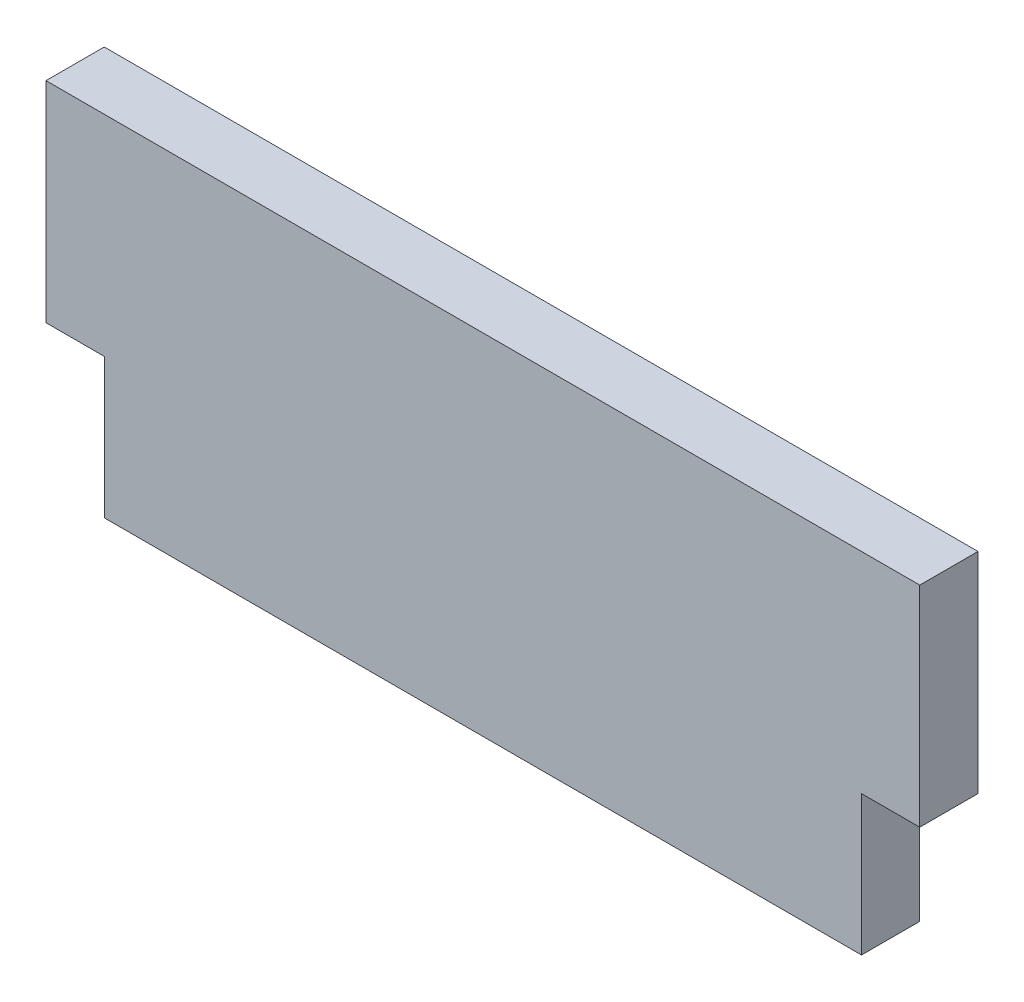
ISO-10303-21;
HEADER;
FILE_DESCRIPTION(('STEP AP214'),'2;1');
FILE_NAME('part.step','',(''),(''),'','','');
FILE_SCHEMA(('AUTOMOTIVE_DESIGN { 1 0 10303 214 1 1 1 1 }'));
ENDSEC;
DATA;
#1=APPLICATION_CONTEXT('core data for automotive mechanical design processes');
#2=APPLICATION_PROTOCOL_DEFINITION('international standard','automotive_design',2000,#1);
#3=PRODUCT_CONTEXT('',#1,'mechanical');
#4=PRODUCT('Part','Part','',(#3));
#5=PRODUCT_RELATED_PRODUCT_CATEGORY('part','',(#4));
#6=PRODUCT_DEFINITION_FORMATION('','',#4);
#7=PRODUCT_DEFINITION_CONTEXT('part definition',#1,'design');
#8=PRODUCT_DEFINITION('design','',#6,#7);
#9=PRODUCT_DEFINITION_SHAPE('','',#8);
#10=(LENGTH_UNIT() NAMED_UNIT(*) SI_UNIT(.MILLI.,.METRE.));
#11=(NAMED_UNIT(*) PLANE_ANGLE_UNIT() SI_UNIT($,.RADIAN.));
#12=(NAMED_UNIT(*) SI_UNIT($,.STERADIAN.) SOLID_ANGLE_UNIT());
#13=UNCERTAINTY_MEASURE_WITH_UNIT(LENGTH_MEASURE(1.E-05),#10,'distance_accuracy_value','');
#14=(GEOMETRIC_REPRESENTATION_CONTEXT(3) GLOBAL_UNCERTAINTY_ASSIGNED_CONTEXT((#13)) GLOBAL_UNIT_ASSIGNED_CONTEXT((#10,
#11,#12)) REPRESENTATION_CONTEXT('',''));
#15=CARTESIAN_POINT('',(0.,0.,0.));
#16=DIRECTION('',(0.,0.,1.));
#17=DIRECTION('',(1.,0.,0.));
#18=AXIS2_PLACEMENT_3D('',#15,#16,#17);
#19=CARTESIAN_POINT('',(0.,0.,5.));
#20=DIRECTION('',(1.,0.,0.));
#21=DIRECTION('',(0.,0.,-1.));
#22=AXIS2_PLACEMENT_3D('',#19,#20,#21);
#23=PLANE('',#22);
#24=DIRECTION('',(0.,-1.,0.));
#25=VECTOR('',#24,1.);
#26=CARTESIAN_POINT('',(0.,0.,0.));
#27=LINE('',#26,#25);
#28=CARTESIAN_POINT('',(0.,30.,0.));
#29=VERTEX_POINT('',#28);
#30=CARTESIAN_POINT('',(0.,12.,0.));
#31=VERTEX_POINT('',#30);
#32=EDGE_CURVE('E128',#29,#31,#27,.T.);
#33=ORIENTED_EDGE('',*,*,#32,.T.);
#34=DIRECTION('',(0.,0.,1.));
#35=VECTOR('',#34,1.);
#36=CARTESIAN_POINT('',(0.,12.,0.));
#37=LINE('',#36,#35);
#38=CARTESIAN_POINT('',(0.,12.,5.));
#39=VERTEX_POINT('',#38);
#40=EDGE_CURVE('E135',#31,#39,#37,.T.);
#41=ORIENTED_EDGE('',*,*,#40,.T.);
#42=DIRECTION('',(0.,-1.,0.));
#43=VECTOR('',#42,1.);
#44=CARTESIAN_POINT('',(0.,0.,5.));
#45=LINE('',#44,#43);
#46=CARTESIAN_POINT('',(0.,30.,5.));
#47=VERTEX_POINT('',#46);
#48=EDGE_CURVE('E140',#47,#39,#45,.T.);
#49=ORIENTED_EDGE('',*,*,#48,.F.);
#50=DIRECTION('',(0.,0.,-1.));
#51=VECTOR('',#50,1.);
#52=CARTESIAN_POINT('',(0.,30.,5.));
#53=LINE('',#52,#51);
#54=EDGE_CURVE('E46',#47,#29,#53,.T.);
#55=ORIENTED_EDGE('',*,*,#54,.T.);
#56=EDGE_LOOP('',(#33,#41,#49,#55));
#57=FACE_BOUND('',#56,.T.);
#58=ADVANCED_FACE('F38',(#57),#23,.F.);
#59=CARTESIAN_POINT('',(0.,0.,5.));
#60=DIRECTION('',(0.,1.,0.));
#61=DIRECTION('',(0.,0.,1.));
#62=AXIS2_PLACEMENT_3D('',#59,#60,#61);
#63=PLANE('',#62);
#64=DIRECTION('',(1.,0.,0.));
#65=VECTOR('',#64,1.);
#66=CARTESIAN_POINT('',(0.,0.,5.));
#67=LINE('',#66,#65);
#68=CARTESIAN_POINT('',(5.,0.,5.));
#69=VERTEX_POINT('',#68);
#70=CARTESIAN_POINT('',(70.,0.,5.));
#71=VERTEX_POINT('',#70);
#72=EDGE_CURVE('E121',#69,#71,#67,.T.);
#73=ORIENTED_EDGE('',*,*,#72,.F.);
#74=DIRECTION('',(0.,0.,1.));
#75=VECTOR('',#74,1.);
#76=CARTESIAN_POINT('',(5.,0.,0.));
#77=LINE('',#76,#75);
#78=CARTESIAN_POINT('',(5.,0.,0.));
#79=VERTEX_POINT('',#78);
#80=EDGE_CURVE('E106',#79,#69,#77,.T.);
#81=ORIENTED_EDGE('',*,*,#80,.F.);
#82=DIRECTION('',(1.,0.,0.));
#83=VECTOR('',#82,1.);
#84=CARTESIAN_POINT('',(0.,0.,0.));
#85=LINE('',#84,#83);
#86=CARTESIAN_POINT('',(70.,0.,0.));
#87=VERTEX_POINT('',#86);
#88=EDGE_CURVE('E119',#79,#87,#85,.T.);
#89=ORIENTED_EDGE('',*,*,#88,.T.);
#90=DIRECTION('',(0.,0.,1.));
#91=VECTOR('',#90,1.);
#92=CARTESIAN_POINT('',(70.,0.,0.));
#93=LINE('',#92,#91);
#94=EDGE_CURVE('E166',#87,#71,#93,.T.);
#95=ORIENTED_EDGE('',*,*,#94,.T.);
#96=EDGE_LOOP('',(#73,#81,#89,#95));
#97=FACE_BOUND('',#96,.T.);
#98=ADVANCED_FACE('F117',(#97),#63,.F.);
#99=CARTESIAN_POINT('',(75.,0.,5.));
#100=DIRECTION('',(-1.,0.,0.));
#101=DIRECTION('',(0.,0.,1.));
#102=AXIS2_PLACEMENT_3D('',#99,#100,#101);
#103=PLANE('',#102);
#104=DIRECTION('',(0.,1.,0.));
#105=VECTOR('',#104,1.);
#106=CARTESIAN_POINT('',(75.,0.,5.));
#107=LINE('',#106,#105);
#108=CARTESIAN_POINT('',(75.,12.,5.));
#109=VERTEX_POINT('',#108);
#110=CARTESIAN_POINT('',(75.,30.,5.));
#111=VERTEX_POINT('',#110);
#112=EDGE_CURVE('E149',#109,#111,#107,.T.);
#113=ORIENTED_EDGE('',*,*,#112,.F.);
#114=DIRECTION('',(0.,0.,1.));
#115=VECTOR('',#114,1.);
#116=CARTESIAN_POINT('',(75.,12.,0.));
#117=LINE('',#116,#115);
#118=CARTESIAN_POINT('',(75.,12.,0.));
#119=VERTEX_POINT('',#118);
#120=EDGE_CURVE('E160',#119,#109,#117,.T.);
#121=ORIENTED_EDGE('',*,*,#120,.F.);
#122=DIRECTION('',(0.,1.,0.));
#123=VECTOR('',#122,1.);
#124=CARTESIAN_POINT('',(75.,0.,0.));
#125=LINE('',#124,#123);
#126=CARTESIAN_POINT('',(75.,30.,0.));
#127=VERTEX_POINT('',#126);
#128=EDGE_CURVE('E127',#119,#127,#125,.T.);
#129=ORIENTED_EDGE('',*,*,#128,.T.);
#130=DIRECTION('',(0.,0.,-1.));
#131=VECTOR('',#130,1.);
#132=CARTESIAN_POINT('',(75.,30.,5.));
#133=LINE('',#132,#131);
#134=EDGE_CURVE('E11',#111,#127,#133,.T.);
#135=ORIENTED_EDGE('',*,*,#134,.F.);
#136=EDGE_LOOP('',(#113,#121,#129,#135));
#137=FACE_BOUND('',#136,.T.);
#138=ADVANCED_FACE('F212',(#137),#103,.F.);
#139=CARTESIAN_POINT('',(0.,30.,5.));
#140=DIRECTION('',(0.,-1.,0.));
#141=DIRECTION('',(0.,0.,-1.));
#142=AXIS2_PLACEMENT_3D('',#139,#140,#141);
#143=PLANE('',#142);
#144=DIRECTION('',(-1.,0.,0.));
#145=VECTOR('',#144,1.);
#146=CARTESIAN_POINT('',(0.,30.,0.));
#147=LINE('',#146,#145);
#148=EDGE_CURVE('E132',#127,#29,#147,.T.);
#149=ORIENTED_EDGE('',*,*,#148,.T.);
#150=ORIENTED_EDGE('',*,*,#54,.F.);
#151=DIRECTION('',(-1.,0.,0.));
#152=VECTOR('',#151,1.);
#153=CARTESIAN_POINT('',(0.,30.,5.));
#154=LINE('',#153,#152);
#155=EDGE_CURVE('E143',#111,#47,#154,.T.);
#156=ORIENTED_EDGE('',*,*,#155,.F.);
#157=ORIENTED_EDGE('',*,*,#134,.T.);
#158=EDGE_LOOP('',(#149,#150,#156,#157));
#159=FACE_BOUND('',#158,.T.);
#160=ADVANCED_FACE('F216',(#159),#143,.F.);
#161=CARTESIAN_POINT('',(0.,0.,5.));
#162=DIRECTION('',(0.,0.,-1.));
#163=DIRECTION('',(-1.,0.,0.));
#164=AXIS2_PLACEMENT_3D('',#161,#162,#163);
#165=PLANE('',#164);
#166=ORIENTED_EDGE('',*,*,#48,.T.);
#167=DIRECTION('',(-1.,0.,0.));
#168=VECTOR('',#167,1.);
#169=CARTESIAN_POINT('',(0.,12.,5.));
#170=LINE('',#169,#168);
#171=CARTESIAN_POINT('',(5.,12.,5.));
#172=VERTEX_POINT('',#171);
#173=EDGE_CURVE('E112',#172,#39,#170,.T.);
#174=ORIENTED_EDGE('',*,*,#173,.F.);
#175=DIRECTION('',(0.,1.,0.));
#176=VECTOR('',#175,1.);
#177=CARTESIAN_POINT('',(5.,0.,5.));
#178=LINE('',#177,#176);
#179=EDGE_CURVE('E169',#69,#172,#178,.T.);
#180=ORIENTED_EDGE('',*,*,#179,.F.);
#181=ORIENTED_EDGE('',*,*,#72,.T.);
#182=DIRECTION('',(0.,-1.,0.));
#183=VECTOR('',#182,1.);
#184=CARTESIAN_POINT('',(70.,0.,5.));
#185=LINE('',#184,#183);
#186=CARTESIAN_POINT('',(70.,12.,5.));
#187=VERTEX_POINT('',#186);
#188=EDGE_CURVE('E170',#187,#71,#185,.T.);
#189=ORIENTED_EDGE('',*,*,#188,.F.);
#190=DIRECTION('',(-1.,0.,0.));
#191=VECTOR('',#190,1.);
#192=CARTESIAN_POINT('',(75.,12.,5.));
#193=LINE('',#192,#191);
#194=EDGE_CURVE('E174',#109,#187,#193,.T.);
#195=ORIENTED_EDGE('',*,*,#194,.F.);
#196=ORIENTED_EDGE('',*,*,#112,.T.);
#197=ORIENTED_EDGE('',*,*,#155,.T.);
#198=EDGE_LOOP('',(#166,#174,#180,#181,#189,#195,#196,#197));
#199=FACE_BOUND('',#198,.T.);
#200=ADVANCED_FACE('F194',(#199),#165,.F.);
#201=CARTESIAN_POINT('',(0.,0.,0.));
#202=DIRECTION('',(0.,0.,-1.));
#203=DIRECTION('',(-1.,0.,0.));
#204=AXIS2_PLACEMENT_3D('',#201,#202,#203);
#205=PLANE('',#204);
#206=DIRECTION('',(-1.,0.,0.));
#207=VECTOR('',#206,1.);
#208=CARTESIAN_POINT('',(0.,12.,0.));
#209=LINE('',#208,#207);
#210=CARTESIAN_POINT('',(5.,12.,0.));
#211=VERTEX_POINT('',#210);
#212=EDGE_CURVE('E53',#211,#31,#209,.T.);
#213=ORIENTED_EDGE('',*,*,#212,.T.);
#214=ORIENTED_EDGE('',*,*,#32,.F.);
#215=ORIENTED_EDGE('',*,*,#148,.F.);
#216=ORIENTED_EDGE('',*,*,#128,.F.);
#217=DIRECTION('',(-1.,0.,0.));
#218=VECTOR('',#217,1.);
#219=CARTESIAN_POINT('',(75.,12.,0.));
#220=LINE('',#219,#218);
#221=CARTESIAN_POINT('',(70.,12.,0.));
#222=VERTEX_POINT('',#221);
#223=EDGE_CURVE('E173',#119,#222,#220,.T.);
#224=ORIENTED_EDGE('',*,*,#223,.T.);
#225=DIRECTION('',(0.,-1.,0.));
#226=VECTOR('',#225,1.);
#227=CARTESIAN_POINT('',(70.,0.,0.));
#228=LINE('',#227,#226);
#229=EDGE_CURVE('E61',#222,#87,#228,.T.);
#230=ORIENTED_EDGE('',*,*,#229,.T.);
#231=ORIENTED_EDGE('',*,*,#88,.F.);
#232=DIRECTION('',(0.,1.,0.));
#233=VECTOR('',#232,1.);
#234=CARTESIAN_POINT('',(5.,0.,0.));
#235=LINE('',#234,#233);
#236=EDGE_CURVE('E102',#79,#211,#235,.T.);
#237=ORIENTED_EDGE('',*,*,#236,.T.);
#238=EDGE_LOOP('',(#213,#214,#215,#216,#224,#230,#231,#237));
#239=FACE_BOUND('',#238,.T.);
#240=ADVANCED_FACE('F124',(#239),#205,.T.);
#241=CARTESIAN_POINT('',(70.,0.,0.));
#242=DIRECTION('',(-1.,0.,0.));
#243=DIRECTION('',(0.,0.,1.));
#244=AXIS2_PLACEMENT_3D('',#241,#242,#243);
#245=PLANE('',#244);
#246=ORIENTED_EDGE('',*,*,#188,.T.);
#247=ORIENTED_EDGE('',*,*,#94,.F.);
#248=ORIENTED_EDGE('',*,*,#229,.F.);
#249=DIRECTION('',(0.,0.,1.));
#250=VECTOR('',#249,1.);
#251=CARTESIAN_POINT('',(70.,12.,0.));
#252=LINE('',#251,#250);
#253=EDGE_CURVE('E163',#222,#187,#252,.T.);
#254=ORIENTED_EDGE('',*,*,#253,.T.);
#255=EDGE_LOOP('',(#246,#247,#248,#254));
#256=FACE_BOUND('',#255,.T.);
#257=ADVANCED_FACE('F204',(#256),#245,.F.);
#258=CARTESIAN_POINT('',(75.,12.,0.));
#259=DIRECTION('',(0.,1.,0.));
#260=DIRECTION('',(0.,0.,1.));
#261=AXIS2_PLACEMENT_3D('',#258,#259,#260);
#262=PLANE('',#261);
#263=ORIENTED_EDGE('',*,*,#194,.T.);
#264=ORIENTED_EDGE('',*,*,#253,.F.);
#265=ORIENTED_EDGE('',*,*,#223,.F.);
#266=ORIENTED_EDGE('',*,*,#120,.T.);
#267=EDGE_LOOP('',(#263,#264,#265,#266));
#268=FACE_BOUND('',#267,.T.);
#269=ADVANCED_FACE('F197',(#268),#262,.F.);
#270=CARTESIAN_POINT('',(0.,12.,0.));
#271=DIRECTION('',(0.,1.,0.));
#272=DIRECTION('',(0.,0.,1.));
#273=AXIS2_PLACEMENT_3D('',#270,#271,#272);
#274=PLANE('',#273);
#275=ORIENTED_EDGE('',*,*,#173,.T.);
#276=ORIENTED_EDGE('',*,*,#40,.F.);
#277=ORIENTED_EDGE('',*,*,#212,.F.);
#278=DIRECTION('',(0.,0.,1.));
#279=VECTOR('',#278,1.);
#280=CARTESIAN_POINT('',(5.,12.,0.));
#281=LINE('',#280,#279);
#282=EDGE_CURVE('E108',#211,#172,#281,.T.);
#283=ORIENTED_EDGE('',*,*,#282,.T.);
#284=EDGE_LOOP('',(#275,#276,#277,#283));
#285=FACE_BOUND('',#284,.T.);
#286=ADVANCED_FACE('F195',(#285),#274,.F.);
#287=CARTESIAN_POINT('',(5.,0.,0.));
#288=DIRECTION('',(1.,0.,0.));
#289=DIRECTION('',(0.,0.,-1.));
#290=AXIS2_PLACEMENT_3D('',#287,#288,#289);
#291=PLANE('',#290);
#292=ORIENTED_EDGE('',*,*,#179,.T.);
#293=ORIENTED_EDGE('',*,*,#282,.F.);
#294=ORIENTED_EDGE('',*,*,#236,.F.);
#295=ORIENTED_EDGE('',*,*,#80,.T.);
#296=EDGE_LOOP('',(#292,#293,#294,#295));
#297=FACE_BOUND('',#296,.T.);
#298=ADVANCED_FACE('F105',(#297),#291,.F.);
#299=CLOSED_SHELL('',(#58,#98,#138,#160,#200,#240,#257,#269,#286,#298));
#300=MANIFOLD_SOLID_BREP('B2',#299);
#301=ADVANCED_BREP_SHAPE_REPRESENTATION('',(#18,#300),#14);
#302=SHAPE_DEFINITION_REPRESENTATION(#9,#301);
ENDSEC;
END-ISO-10303-21;
